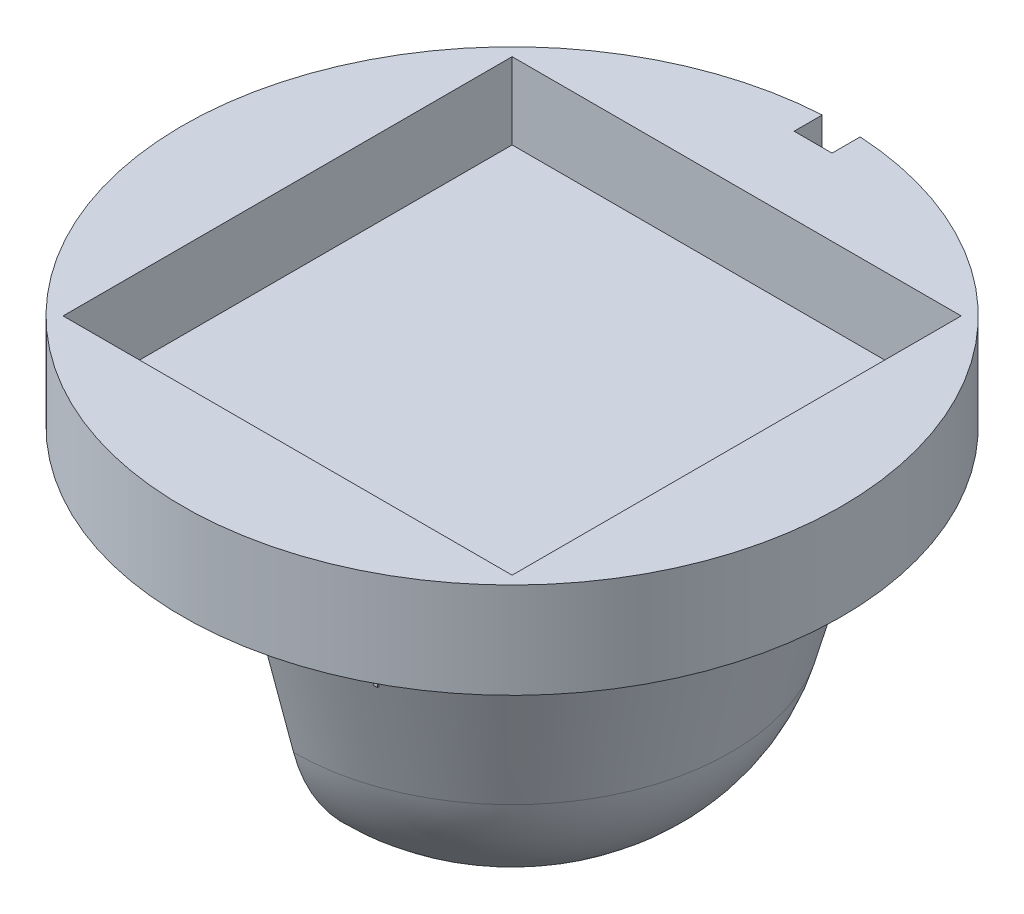
ISO-10303-21;
HEADER;
FILE_DESCRIPTION(('STEP AP214'),'2;1');
FILE_NAME('part.step','',(''),(''),'','','');
FILE_SCHEMA(('AUTOMOTIVE_DESIGN { 1 0 10303 214 1 1 1 1 }'));
ENDSEC;
DATA;
#1=APPLICATION_CONTEXT('core data for automotive mechanical design processes');
#2=APPLICATION_PROTOCOL_DEFINITION('international standard','automotive_design',2000,#1);
#3=PRODUCT_CONTEXT('',#1,'mechanical');
#4=PRODUCT('Part','Part','',(#3));
#5=PRODUCT_RELATED_PRODUCT_CATEGORY('part','',(#4));
#6=PRODUCT_DEFINITION_FORMATION('','',#4);
#7=PRODUCT_DEFINITION_CONTEXT('part definition',#1,'design');
#8=PRODUCT_DEFINITION('design','',#6,#7);
#9=PRODUCT_DEFINITION_SHAPE('','',#8);
#10=(LENGTH_UNIT() NAMED_UNIT(*) SI_UNIT(.MILLI.,.METRE.));
#11=(NAMED_UNIT(*) PLANE_ANGLE_UNIT() SI_UNIT($,.RADIAN.));
#12=(NAMED_UNIT(*) SI_UNIT($,.STERADIAN.) SOLID_ANGLE_UNIT());
#13=UNCERTAINTY_MEASURE_WITH_UNIT(LENGTH_MEASURE(1.E-05),#10,'distance_accuracy_value','');
#14=(GEOMETRIC_REPRESENTATION_CONTEXT(3) GLOBAL_UNCERTAINTY_ASSIGNED_CONTEXT((#13)) GLOBAL_UNIT_ASSIGNED_CONTEXT((#10,
#11,#12)) REPRESENTATION_CONTEXT('',''));
#15=CARTESIAN_POINT('',(0.,0.,0.));
#16=DIRECTION('',(0.,0.,1.));
#17=DIRECTION('',(1.,0.,0.));
#18=AXIS2_PLACEMENT_3D('',#15,#16,#17);
#19=CARTESIAN_POINT('',(0.,-2.,0.));
#20=DIRECTION('',(0.,-1.,0.));
#21=DIRECTION('',(0.,0.,-1.));
#22=AXIS2_PLACEMENT_3D('',#19,#20,#21);
#23=PLANE('',#22);
#24=DIRECTION('',(0.,0.,1.));
#25=VECTOR('',#24,1.);
#26=CARTESIAN_POINT('',(1.98519362052624,-2.,-37.5));
#27=LINE('',#26,#25);
#28=CARTESIAN_POINT('',(1.98519362052624,-2.,-34.4428367921259));
#29=VERTEX_POINT('',#28);
#30=CARTESIAN_POINT('',(1.98519362052624,-2.,-31.5));
#31=VERTEX_POINT('',#30);
#32=EDGE_CURVE('E200',#29,#31,#27,.T.);
#33=ORIENTED_EDGE('',*,*,#32,.F.);
#34=CARTESIAN_POINT('',(0.,-2.,0.));
#35=DIRECTION('',(0.,-1.,0.));
#36=DIRECTION('',(0.,0.,-1.));
#37=AXIS2_PLACEMENT_3D('',#34,#35,#36);
#38=CIRCLE('',#37,34.5);
#39=CARTESIAN_POINT('',(-1.98519362052625,-2.,-34.4428367921259));
#40=VERTEX_POINT('',#39);
#41=EDGE_CURVE('E367',#29,#40,#38,.T.);
#42=ORIENTED_EDGE('',*,*,#41,.T.);
#43=DIRECTION('',(0.,0.,-1.));
#44=VECTOR('',#43,1.);
#45=CARTESIAN_POINT('',(-1.98519362052625,-2.,-37.5));
#46=LINE('',#45,#44);
#47=CARTESIAN_POINT('',(-1.98519362052625,-2.,-31.5));
#48=VERTEX_POINT('',#47);
#49=EDGE_CURVE('E59',#48,#40,#46,.T.);
#50=ORIENTED_EDGE('',*,*,#49,.F.);
#51=DIRECTION('',(-1.,0.,0.));
#52=VECTOR('',#51,1.);
#53=CARTESIAN_POINT('',(-1.98519362052625,-2.,-31.5));
#54=LINE('',#53,#52);
#55=EDGE_CURVE('E224',#31,#48,#54,.T.);
#56=ORIENTED_EDGE('',*,*,#55,.F.);
#57=EDGE_LOOP('',(#33,#42,#50,#56));
#58=FACE_BOUND('',#57,.T.);
#59=DIRECTION('',(0.,0.,-1.));
#60=VECTOR('',#59,1.);
#61=CARTESIAN_POINT('',(0.,-2.,-18.));
#62=LINE('',#61,#60);
#63=CARTESIAN_POINT('',(0.,-2.,-18.));
#64=VERTEX_POINT('',#63);
#65=CARTESIAN_POINT('',(0.,-2.,-27.7320508075689));
#66=VERTEX_POINT('',#65);
#67=EDGE_CURVE('E355',#64,#66,#62,.T.);
#68=ORIENTED_EDGE('',*,*,#67,.F.);
#69=CARTESIAN_POINT('',(0.,-2.,0.));
#70=DIRECTION('',(0.,1.,0.));
#71=DIRECTION('',(0.,0.,-1.));
#72=AXIS2_PLACEMENT_3D('',#69,#70,#71);
#73=CIRCLE('',#72,18.);
#74=CARTESIAN_POINT('',(0.,-2.,18.));
#75=VERTEX_POINT('',#74);
#76=EDGE_CURVE('E345',#75,#64,#73,.T.);
#77=ORIENTED_EDGE('',*,*,#76,.F.);
#78=DIRECTION('',(0.,0.,-1.));
#79=VECTOR('',#78,1.);
#80=CARTESIAN_POINT('',(0.,-2.,28.));
#81=LINE('',#80,#79);
#82=CARTESIAN_POINT('',(0.,-2.,27.7320508075689));
#83=VERTEX_POINT('',#82);
#84=EDGE_CURVE('E351',#83,#75,#81,.T.);
#85=ORIENTED_EDGE('',*,*,#84,.F.);
#86=CARTESIAN_POINT('',(0.,-2.,0.));
#87=DIRECTION('',(0.,-1.,0.));
#88=DIRECTION('',(0.,0.,-1.));
#89=AXIS2_PLACEMENT_3D('',#86,#87,#88);
#90=CIRCLE('',#89,27.7320508075689);
#91=EDGE_CURVE('E421',#83,#66,#90,.F.);
#92=ORIENTED_EDGE('',*,*,#91,.T.);
#93=EDGE_LOOP('',(#68,#77,#85,#92));
#94=FACE_BOUND('',#93,.T.);
#95=ADVANCED_FACE('F43',(#58,#94),#23,.T.);
#96=CARTESIAN_POINT('',(0.,8.,0.));
#97=DIRECTION('',(0.,1.,0.));
#98=DIRECTION('',(0.,0.,1.));
#99=AXIS2_PLACEMENT_3D('',#96,#97,#98);
#100=PLANE('',#99);
#101=DIRECTION('',(0.,0.,1.));
#102=VECTOR('',#101,1.);
#103=CARTESIAN_POINT('',(1.98519362052624,8.,-37.5));
#104=LINE('',#103,#102);
#105=CARTESIAN_POINT('',(1.98519362052624,8.,-34.4428367921259));
#106=VERTEX_POINT('',#105);
#107=CARTESIAN_POINT('',(1.98519362052624,8.,-31.5));
#108=VERTEX_POINT('',#107);
#109=EDGE_CURVE('E198',#106,#108,#104,.T.);
#110=ORIENTED_EDGE('',*,*,#109,.T.);
#111=DIRECTION('',(-1.,0.,0.));
#112=VECTOR('',#111,1.);
#113=CARTESIAN_POINT('',(-1.98519362052625,8.,-31.5));
#114=LINE('',#113,#112);
#115=CARTESIAN_POINT('',(-1.98519362052625,8.,-31.5));
#116=VERTEX_POINT('',#115);
#117=EDGE_CURVE('E209',#108,#116,#114,.T.);
#118=ORIENTED_EDGE('',*,*,#117,.T.);
#119=DIRECTION('',(0.,0.,-1.));
#120=VECTOR('',#119,1.);
#121=CARTESIAN_POINT('',(-1.98519362052625,8.,-37.5));
#122=LINE('',#121,#120);
#123=CARTESIAN_POINT('',(-1.98519362052625,8.,-34.4428367921259));
#124=VERTEX_POINT('',#123);
#125=EDGE_CURVE('E206',#116,#124,#122,.T.);
#126=ORIENTED_EDGE('',*,*,#125,.T.);
#127=CARTESIAN_POINT('',(0.,8.,0.));
#128=DIRECTION('',(0.,1.,0.));
#129=DIRECTION('',(0.,0.,1.));
#130=AXIS2_PLACEMENT_3D('',#127,#128,#129);
#131=CIRCLE('',#130,34.5);
#132=EDGE_CURVE('E220',#124,#106,#131,.T.);
#133=ORIENTED_EDGE('',*,*,#132,.T.);
#134=EDGE_LOOP('',(#110,#118,#126,#133));
#135=FACE_BOUND('',#134,.T.);
#136=DIRECTION('',(-1.,0.,0.));
#137=VECTOR('',#136,1.);
#138=CARTESIAN_POINT('',(-23.5,8.,-23.5));
#139=LINE('',#138,#137);
#140=CARTESIAN_POINT('',(23.5,8.,-23.5));
#141=VERTEX_POINT('',#140);
#142=CARTESIAN_POINT('',(-23.5,8.,-23.5));
#143=VERTEX_POINT('',#142);
#144=EDGE_CURVE('E375',#141,#143,#139,.T.);
#145=ORIENTED_EDGE('',*,*,#144,.F.);
#146=DIRECTION('',(0.,0.,-1.));
#147=VECTOR('',#146,1.);
#148=CARTESIAN_POINT('',(23.5,8.,23.5));
#149=LINE('',#148,#147);
#150=CARTESIAN_POINT('',(23.5,8.,23.5));
#151=VERTEX_POINT('',#150);
#152=EDGE_CURVE('E372',#151,#141,#149,.T.);
#153=ORIENTED_EDGE('',*,*,#152,.F.);
#154=DIRECTION('',(1.,0.,0.));
#155=VECTOR('',#154,1.);
#156=CARTESIAN_POINT('',(-23.5,8.,23.5));
#157=LINE('',#156,#155);
#158=CARTESIAN_POINT('',(-23.5,8.,23.5));
#159=VERTEX_POINT('',#158);
#160=EDGE_CURVE('E383',#159,#151,#157,.T.);
#161=ORIENTED_EDGE('',*,*,#160,.F.);
#162=DIRECTION('',(0.,0.,1.));
#163=VECTOR('',#162,1.);
#164=CARTESIAN_POINT('',(-23.5,8.,23.5));
#165=LINE('',#164,#163);
#166=EDGE_CURVE('E379',#143,#159,#165,.T.);
#167=ORIENTED_EDGE('',*,*,#166,.F.);
#168=EDGE_LOOP('',(#145,#153,#161,#167));
#169=FACE_BOUND('',#168,.T.);
#170=ADVANCED_FACE('F217',(#135,#169),#100,.T.);
#171=CARTESIAN_POINT('',(0.,8.,0.));
#172=DIRECTION('',(0.,-1.,0.));
#173=DIRECTION('',(0.,0.,-1.));
#174=AXIS2_PLACEMENT_3D('',#171,#172,#173);
#175=CYLINDRICAL_SURFACE('',#174,34.5);
#176=ORIENTED_EDGE('',*,*,#41,.F.);
#177=DIRECTION('',(0.,-1.,0.));
#178=VECTOR('',#177,1.);
#179=CARTESIAN_POINT('',(1.98519362052624,8.,-34.4428367921259));
#180=LINE('',#179,#178);
#181=EDGE_CURVE('E12',#29,#106,#180,.F.);
#182=ORIENTED_EDGE('',*,*,#181,.T.);
#183=ORIENTED_EDGE('',*,*,#132,.F.);
#184=DIRECTION('',(0.,-1.,0.));
#185=VECTOR('',#184,1.);
#186=CARTESIAN_POINT('',(-1.98519362052625,8.,-34.4428367921259));
#187=LINE('',#186,#185);
#188=EDGE_CURVE('E52',#124,#40,#187,.T.);
#189=ORIENTED_EDGE('',*,*,#188,.T.);
#190=EDGE_LOOP('',(#176,#182,#183,#189));
#191=FACE_BOUND('',#190,.T.);
#192=ADVANCED_FACE('F434',(#191),#175,.T.);
#193=CARTESIAN_POINT('',(23.5,8.,23.5));
#194=DIRECTION('',(-1.,0.,0.));
#195=DIRECTION('',(0.,0.,1.));
#196=AXIS2_PLACEMENT_3D('',#193,#194,#195);
#197=PLANE('',#196);
#198=DIRECTION('',(0.,0.,-1.));
#199=VECTOR('',#198,1.);
#200=CARTESIAN_POINT('',(23.5,0.,23.5));
#201=LINE('',#200,#199);
#202=CARTESIAN_POINT('',(23.5,0.,23.5));
#203=VERTEX_POINT('',#202);
#204=CARTESIAN_POINT('',(23.5,0.,-23.5));
#205=VERTEX_POINT('',#204);
#206=EDGE_CURVE('E371',#203,#205,#201,.T.);
#207=ORIENTED_EDGE('',*,*,#206,.F.);
#208=DIRECTION('',(0.,-1.,0.));
#209=VECTOR('',#208,1.);
#210=CARTESIAN_POINT('',(23.5,8.,23.5));
#211=LINE('',#210,#209);
#212=EDGE_CURVE('E386',#151,#203,#211,.T.);
#213=ORIENTED_EDGE('',*,*,#212,.F.);
#214=ORIENTED_EDGE('',*,*,#152,.T.);
#215=DIRECTION('',(0.,-1.,0.));
#216=VECTOR('',#215,1.);
#217=CARTESIAN_POINT('',(23.5,8.,-23.5));
#218=LINE('',#217,#216);
#219=EDGE_CURVE('E409',#141,#205,#218,.T.);
#220=ORIENTED_EDGE('',*,*,#219,.T.);
#221=EDGE_LOOP('',(#207,#213,#214,#220));
#222=FACE_BOUND('',#221,.T.);
#223=ADVANCED_FACE('F493',(#222),#197,.T.);
#224=CARTESIAN_POINT('',(-23.5,8.,-23.5));
#225=DIRECTION('',(0.,0.,1.));
#226=DIRECTION('',(1.,0.,0.));
#227=AXIS2_PLACEMENT_3D('',#224,#225,#226);
#228=PLANE('',#227);
#229=DIRECTION('',(-1.,0.,0.));
#230=VECTOR('',#229,1.);
#231=CARTESIAN_POINT('',(-23.5,0.,-23.5));
#232=LINE('',#231,#230);
#233=CARTESIAN_POINT('',(-23.5,0.,-23.5));
#234=VERTEX_POINT('',#233);
#235=EDGE_CURVE('E390',#205,#234,#232,.T.);
#236=ORIENTED_EDGE('',*,*,#235,.F.);
#237=ORIENTED_EDGE('',*,*,#219,.F.);
#238=ORIENTED_EDGE('',*,*,#144,.T.);
#239=DIRECTION('',(0.,-1.,0.));
#240=VECTOR('',#239,1.);
#241=CARTESIAN_POINT('',(-23.5,8.,-23.5));
#242=LINE('',#241,#240);
#243=EDGE_CURVE('E406',#143,#234,#242,.T.);
#244=ORIENTED_EDGE('',*,*,#243,.T.);
#245=EDGE_LOOP('',(#236,#237,#238,#244));
#246=FACE_BOUND('',#245,.T.);
#247=ADVANCED_FACE('F489',(#246),#228,.T.);
#248=CARTESIAN_POINT('',(-23.5,8.,23.5));
#249=DIRECTION('',(1.,0.,0.));
#250=DIRECTION('',(0.,0.,-1.));
#251=AXIS2_PLACEMENT_3D('',#248,#249,#250);
#252=PLANE('',#251);
#253=DIRECTION('',(0.,0.,1.));
#254=VECTOR('',#253,1.);
#255=CARTESIAN_POINT('',(-23.5,0.,23.5));
#256=LINE('',#255,#254);
#257=CARTESIAN_POINT('',(-23.5,0.,23.5));
#258=VERTEX_POINT('',#257);
#259=EDGE_CURVE('E394',#234,#258,#256,.T.);
#260=ORIENTED_EDGE('',*,*,#259,.F.);
#261=ORIENTED_EDGE('',*,*,#243,.F.);
#262=ORIENTED_EDGE('',*,*,#166,.T.);
#263=DIRECTION('',(0.,-1.,0.));
#264=VECTOR('',#263,1.);
#265=CARTESIAN_POINT('',(-23.5,8.,23.5));
#266=LINE('',#265,#264);
#267=EDGE_CURVE('E403',#159,#258,#266,.T.);
#268=ORIENTED_EDGE('',*,*,#267,.T.);
#269=EDGE_LOOP('',(#260,#261,#262,#268));
#270=FACE_BOUND('',#269,.T.);
#271=ADVANCED_FACE('F485',(#270),#252,.T.);
#272=CARTESIAN_POINT('',(-23.5,8.,23.5));
#273=DIRECTION('',(0.,0.,-1.));
#274=DIRECTION('',(-1.,0.,0.));
#275=AXIS2_PLACEMENT_3D('',#272,#273,#274);
#276=PLANE('',#275);
#277=DIRECTION('',(1.,0.,0.));
#278=VECTOR('',#277,1.);
#279=CARTESIAN_POINT('',(-23.5,0.,23.5));
#280=LINE('',#279,#278);
#281=EDGE_CURVE('E376',#258,#203,#280,.T.);
#282=ORIENTED_EDGE('',*,*,#281,.F.);
#283=ORIENTED_EDGE('',*,*,#267,.F.);
#284=ORIENTED_EDGE('',*,*,#160,.T.);
#285=ORIENTED_EDGE('',*,*,#212,.T.);
#286=EDGE_LOOP('',(#282,#283,#284,#285));
#287=FACE_BOUND('',#286,.T.);
#288=ADVANCED_FACE('F481',(#287),#276,.T.);
#289=CARTESIAN_POINT('',(0.,0.,0.));
#290=DIRECTION('',(0.,-1.,0.));
#291=DIRECTION('',(0.,0.,-1.));
#292=AXIS2_PLACEMENT_3D('',#289,#290,#291);
#293=PLANE('',#292);
#294=ORIENTED_EDGE('',*,*,#281,.T.);
#295=ORIENTED_EDGE('',*,*,#206,.T.);
#296=ORIENTED_EDGE('',*,*,#235,.T.);
#297=ORIENTED_EDGE('',*,*,#259,.T.);
#298=EDGE_LOOP('',(#294,#295,#296,#297));
#299=FACE_BOUND('',#298,.T.);
#300=ADVANCED_FACE('F477',(#299),#293,.F.);
#301=CARTESIAN_POINT('',(0.,-26.,0.));
#302=DIRECTION('',(0.,1.,0.));
#303=DIRECTION('',(0.,0.,1.));
#304=AXIS2_PLACEMENT_3D('',#301,#302,#303);
#305=CYLINDRICAL_SURFACE('',#304,18.);
#306=ORIENTED_EDGE('',*,*,#76,.T.);
#307=DIRECTION('',(0.,1.,0.));
#308=VECTOR('',#307,1.);
#309=CARTESIAN_POINT('',(0.,-26.,-18.));
#310=LINE('',#309,#308);
#311=CARTESIAN_POINT('',(0.,-26.,-18.));
#312=VERTEX_POINT('',#311);
#313=EDGE_CURVE('E364',#312,#64,#310,.T.);
#314=ORIENTED_EDGE('',*,*,#313,.F.);
#315=CARTESIAN_POINT('',(0.,-26.,0.));
#316=DIRECTION('',(0.,1.,0.));
#317=DIRECTION('',(0.,0.,-1.));
#318=AXIS2_PLACEMENT_3D('',#315,#316,#317);
#319=CIRCLE('',#318,18.);
#320=CARTESIAN_POINT('',(0.,-26.,18.));
#321=VERTEX_POINT('',#320);
#322=EDGE_CURVE('E346',#321,#312,#319,.T.);
#323=ORIENTED_EDGE('',*,*,#322,.F.);
#324=DIRECTION('',(0.,1.,0.));
#325=VECTOR('',#324,1.);
#326=CARTESIAN_POINT('',(0.,-26.,18.));
#327=LINE('',#326,#325);
#328=EDGE_CURVE('E350',#321,#75,#327,.T.);
#329=ORIENTED_EDGE('',*,*,#328,.T.);
#330=EDGE_LOOP('',(#306,#314,#323,#329));
#331=FACE_BOUND('',#330,.T.);
#332=ADVANCED_FACE('F461',(#331),#305,.F.);
#333=CARTESIAN_POINT('',(0.,-26.,-18.));
#334=DIRECTION('',(1.,0.,0.));
#335=DIRECTION('',(0.,0.,-1.));
#336=AXIS2_PLACEMENT_3D('',#333,#334,#335);
#337=PLANE('',#336);
#338=DIRECTION('',(0.,0.,1.));
#339=VECTOR('',#338,1.);
#340=CARTESIAN_POINT('',(0.,-8.66672781678168,-24.1));
#341=LINE('',#340,#339);
#342=CARTESIAN_POINT('',(0.,-8.66672781678168,-24.1));
#343=VERTEX_POINT('',#342);
#344=CARTESIAN_POINT('',(0.,-8.66672781678168,-19.4));
#345=VERTEX_POINT('',#344);
#346=EDGE_CURVE('E257',#343,#345,#341,.T.);
#347=ORIENTED_EDGE('',*,*,#346,.F.);
#348=DIRECTION('',(0.,-1.,0.));
#349=VECTOR('',#348,1.);
#350=CARTESIAN_POINT('',(0.,-3.96672781678169,-24.1));
#351=LINE('',#350,#349);
#352=CARTESIAN_POINT('',(0.,-3.96672781678169,-24.1));
#353=VERTEX_POINT('',#352);
#354=EDGE_CURVE('E254',#353,#343,#351,.T.);
#355=ORIENTED_EDGE('',*,*,#354,.F.);
#356=DIRECTION('',(0.,0.,-1.));
#357=VECTOR('',#356,1.);
#358=CARTESIAN_POINT('',(0.,-3.96672781678169,-24.1));
#359=LINE('',#358,#357);
#360=CARTESIAN_POINT('',(0.,-3.96672781678169,-19.4));
#361=VERTEX_POINT('',#360);
#362=EDGE_CURVE('E241',#361,#353,#359,.T.);
#363=ORIENTED_EDGE('',*,*,#362,.F.);
#364=DIRECTION('',(0.,1.,0.));
#365=VECTOR('',#364,1.);
#366=CARTESIAN_POINT('',(0.,-3.96672781678169,-19.4));
#367=LINE('',#366,#365);
#368=EDGE_CURVE('E262',#345,#361,#367,.T.);
#369=ORIENTED_EDGE('',*,*,#368,.F.);
#370=EDGE_LOOP('',(#347,#355,#363,#369));
#371=FACE_BOUND('',#370,.T.);
#372=DIRECTION('',(0.,0.965925826289066,-0.258819045102528));
#373=VECTOR('',#372,1.);
#374=CARTESIAN_POINT('',(0.,-105.497422611925,0.));
#375=LINE('',#374,#373);
#376=CARTESIAN_POINT('',(0.,-20.1360214514236,-22.8725185057462));
#377=VERTEX_POINT('',#376);
#378=EDGE_CURVE('E418',#66,#377,#375,.F.);
#379=ORIENTED_EDGE('',*,*,#378,.T.);
#380=CARTESIAN_POINT('',(0.,-14.959640549373,-3.55400197996491));
#381=DIRECTION('',(1.,0.,0.));
#382=DIRECTION('',(0.,0.,-1.));
#383=AXIS2_PLACEMENT_3D('',#380,#381,#382);
#384=CIRCLE('',#383,20.);
#385=CARTESIAN_POINT('',(0.,-31.,-15.5));
#386=VERTEX_POINT('',#385);
#387=EDGE_CURVE('E429',#377,#386,#384,.F.);
#388=ORIENTED_EDGE('',*,*,#387,.T.);
#389=DIRECTION('',(0.,1.,0.));
#390=VECTOR('',#389,1.);
#391=CARTESIAN_POINT('',(0.,-31.,-15.5));
#392=LINE('',#391,#390);
#393=CARTESIAN_POINT('',(0.,-26.,-15.5));
#394=VERTEX_POINT('',#393);
#395=EDGE_CURVE('E328',#386,#394,#392,.T.);
#396=ORIENTED_EDGE('',*,*,#395,.T.);
#397=DIRECTION('',(0.,0.,-1.));
#398=VECTOR('',#397,1.);
#399=CARTESIAN_POINT('',(0.,-26.,-15.5));
#400=LINE('',#399,#398);
#401=EDGE_CURVE('E329',#394,#312,#400,.T.);
#402=ORIENTED_EDGE('',*,*,#401,.T.);
#403=ORIENTED_EDGE('',*,*,#313,.T.);
#404=ORIENTED_EDGE('',*,*,#67,.T.);
#405=EDGE_LOOP('',(#379,#388,#396,#402,#403,#404));
#406=FACE_BOUND('',#405,.T.);
#407=ADVANCED_FACE('F444',(#371,#406),#337,.F.);
#408=CARTESIAN_POINT('',(0.,-26.,28.));
#409=DIRECTION('',(1.,0.,0.));
#410=DIRECTION('',(0.,0.,-1.));
#411=AXIS2_PLACEMENT_3D('',#408,#409,#410);
#412=PLANE('',#411);
#413=DIRECTION('',(0.,0.,-1.));
#414=VECTOR('',#413,1.);
#415=CARTESIAN_POINT('',(0.,-3.9667278,24.1));
#416=LINE('',#415,#414);
#417=CARTESIAN_POINT('',(0.,-3.9667278,24.1));
#418=VERTEX_POINT('',#417);
#419=CARTESIAN_POINT('',(0.,-3.9667278,19.4));
#420=VERTEX_POINT('',#419);
#421=EDGE_CURVE('E302',#418,#420,#416,.T.);
#422=ORIENTED_EDGE('',*,*,#421,.F.);
#423=DIRECTION('',(0.,1.,0.));
#424=VECTOR('',#423,1.);
#425=CARTESIAN_POINT('',(0.,-3.9667278,24.1));
#426=LINE('',#425,#424);
#427=CARTESIAN_POINT('',(0.,-8.6429328472573,24.1));
#428=VERTEX_POINT('',#427);
#429=EDGE_CURVE('E234',#428,#418,#426,.T.);
#430=ORIENTED_EDGE('',*,*,#429,.F.);
#431=DIRECTION('',(0.,0.,1.));
#432=VECTOR('',#431,1.);
#433=CARTESIAN_POINT('',(0.,-8.6429328472573,24.1));
#434=LINE('',#433,#432);
#435=CARTESIAN_POINT('',(0.,-8.6429328472573,19.4));
#436=VERTEX_POINT('',#435);
#437=EDGE_CURVE('E287',#436,#428,#434,.T.);
#438=ORIENTED_EDGE('',*,*,#437,.F.);
#439=DIRECTION('',(0.,-1.,0.));
#440=VECTOR('',#439,1.);
#441=CARTESIAN_POINT('',(0.,-3.9667278,19.4));
#442=LINE('',#441,#440);
#443=EDGE_CURVE('E306',#420,#436,#442,.T.);
#444=ORIENTED_EDGE('',*,*,#443,.F.);
#445=EDGE_LOOP('',(#422,#430,#438,#444));
#446=FACE_BOUND('',#445,.T.);
#447=DIRECTION('',(0.,1.,0.));
#448=VECTOR('',#447,1.);
#449=CARTESIAN_POINT('',(0.,-31.,15.5));
#450=LINE('',#449,#448);
#451=CARTESIAN_POINT('',(0.,-31.,15.5));
#452=VERTEX_POINT('',#451);
#453=CARTESIAN_POINT('',(0.,-26.,15.5));
#454=VERTEX_POINT('',#453);
#455=EDGE_CURVE('E341',#452,#454,#450,.T.);
#456=ORIENTED_EDGE('',*,*,#455,.F.);
#457=CARTESIAN_POINT('',(0.,-14.959640549373,3.55400197996491));
#458=DIRECTION('',(1.,0.,0.));
#459=DIRECTION('',(0.,0.,-1.));
#460=AXIS2_PLACEMENT_3D('',#457,#458,#459);
#461=CIRCLE('',#460,20.);
#462=CARTESIAN_POINT('',(0.,-20.1360214514236,22.8725185057462));
#463=VERTEX_POINT('',#462);
#464=EDGE_CURVE('E424',#452,#463,#461,.F.);
#465=ORIENTED_EDGE('',*,*,#464,.T.);
#466=DIRECTION('',(0.,-0.965925826289066,-0.258819045102528));
#467=VECTOR('',#466,1.);
#468=CARTESIAN_POINT('',(0.,-105.497422611925,0.));
#469=LINE('',#468,#467);
#470=EDGE_CURVE('E415',#463,#83,#469,.F.);
#471=ORIENTED_EDGE('',*,*,#470,.T.);
#472=ORIENTED_EDGE('',*,*,#84,.T.);
#473=ORIENTED_EDGE('',*,*,#328,.F.);
#474=DIRECTION('',(0.,0.,-1.));
#475=VECTOR('',#474,1.);
#476=CARTESIAN_POINT('',(0.,-26.,28.));
#477=LINE('',#476,#475);
#478=EDGE_CURVE('E272',#321,#454,#477,.T.);
#479=ORIENTED_EDGE('',*,*,#478,.T.);
#480=EDGE_LOOP('',(#456,#465,#471,#472,#473,#479));
#481=FACE_BOUND('',#480,.T.);
#482=ADVANCED_FACE('F462',(#446,#481),#412,.F.);
#483=CARTESIAN_POINT('',(0.,-26.,0.));
#484=DIRECTION('',(0.,-1.,0.));
#485=DIRECTION('',(0.,0.,-1.));
#486=AXIS2_PLACEMENT_3D('',#483,#484,#485);
#487=PLANE('',#486);
#488=ORIENTED_EDGE('',*,*,#478,.F.);
#489=ORIENTED_EDGE('',*,*,#322,.T.);
#490=ORIENTED_EDGE('',*,*,#401,.F.);
#491=CARTESIAN_POINT('',(0.,-26.,0.));
#492=DIRECTION('',(0.,1.,0.));
#493=DIRECTION('',(0.,0.,-1.));
#494=AXIS2_PLACEMENT_3D('',#491,#492,#493);
#495=CIRCLE('',#494,15.5);
#496=EDGE_CURVE('E332',#454,#394,#495,.T.);
#497=ORIENTED_EDGE('',*,*,#496,.F.);
#498=EDGE_LOOP('',(#488,#489,#490,#497));
#499=FACE_BOUND('',#498,.T.);
#500=ADVANCED_FACE('F458',(#499),#487,.F.);
#501=CARTESIAN_POINT('',(0.,-31.,0.));
#502=DIRECTION('',(0.,1.,0.));
#503=DIRECTION('',(0.,0.,1.));
#504=AXIS2_PLACEMENT_3D('',#501,#502,#503);
#505=CYLINDRICAL_SURFACE('',#504,15.5);
#506=ORIENTED_EDGE('',*,*,#496,.T.);
#507=ORIENTED_EDGE('',*,*,#395,.F.);
#508=CARTESIAN_POINT('',(0.,-31.,0.));
#509=DIRECTION('',(0.,1.,0.));
#510=DIRECTION('',(0.,0.,-1.));
#511=AXIS2_PLACEMENT_3D('',#508,#509,#510);
#512=CIRCLE('',#511,15.5);
#513=EDGE_CURVE('E324',#452,#386,#512,.T.);
#514=ORIENTED_EDGE('',*,*,#513,.F.);
#515=ORIENTED_EDGE('',*,*,#455,.T.);
#516=EDGE_LOOP('',(#506,#507,#514,#515));
#517=FACE_BOUND('',#516,.T.);
#518=ADVANCED_FACE('F454',(#517),#505,.F.);
#519=CARTESIAN_POINT('',(9.99999999999999,-3.9667278,24.1));
#520=DIRECTION('',(0.,0.,1.));
#521=DIRECTION('',(1.,0.,0.));
#522=AXIS2_PLACEMENT_3D('',#519,#520,#521);
#523=PLANE('',#522);
#524=ORIENTED_EDGE('',*,*,#429,.T.);
#525=DIRECTION('',(-1.,0.,0.));
#526=VECTOR('',#525,1.);
#527=CARTESIAN_POINT('',(9.99999999999999,-3.9667278,24.1));
#528=LINE('',#527,#526);
#529=CARTESIAN_POINT('',(9.99999999999999,-3.9667278,24.1));
#530=VERTEX_POINT('',#529);
#531=EDGE_CURVE('E299',#530,#418,#528,.T.);
#532=ORIENTED_EDGE('',*,*,#531,.F.);
#533=DIRECTION('',(0.,1.,0.));
#534=VECTOR('',#533,1.);
#535=CARTESIAN_POINT('',(9.99999999999999,-3.9667278,24.1));
#536=LINE('',#535,#534);
#537=CARTESIAN_POINT('',(9.99999999999999,-8.6429328472573,24.1));
#538=VERTEX_POINT('',#537);
#539=EDGE_CURVE('E282',#538,#530,#536,.T.);
#540=ORIENTED_EDGE('',*,*,#539,.F.);
#541=DIRECTION('',(-1.,0.,0.));
#542=VECTOR('',#541,1.);
#543=CARTESIAN_POINT('',(9.99999999999999,-8.6429328472573,24.1));
#544=LINE('',#543,#542);
#545=EDGE_CURVE('E258',#538,#428,#544,.T.);
#546=ORIENTED_EDGE('',*,*,#545,.T.);
#547=EDGE_LOOP('',(#524,#532,#540,#546));
#548=FACE_BOUND('',#547,.T.);
#549=ADVANCED_FACE('F542',(#548),#523,.F.);
#550=CARTESIAN_POINT('',(9.99999999999999,-8.6429328472573,24.1));
#551=DIRECTION('',(0.,-1.,0.));
#552=DIRECTION('',(0.,0.,-1.));
#553=AXIS2_PLACEMENT_3D('',#550,#551,#552);
#554=PLANE('',#553);
#555=ORIENTED_EDGE('',*,*,#437,.T.);
#556=ORIENTED_EDGE('',*,*,#545,.F.);
#557=DIRECTION('',(0.,0.,1.));
#558=VECTOR('',#557,1.);
#559=CARTESIAN_POINT('',(9.99999999999999,-8.6429328472573,24.1));
#560=LINE('',#559,#558);
#561=CARTESIAN_POINT('',(9.99999999999999,-8.6429328472573,19.4));
#562=VERTEX_POINT('',#561);
#563=EDGE_CURVE('E295',#562,#538,#560,.T.);
#564=ORIENTED_EDGE('',*,*,#563,.F.);
#565=DIRECTION('',(-1.,0.,0.));
#566=VECTOR('',#565,1.);
#567=CARTESIAN_POINT('',(9.99999999999999,-8.6429328472573,19.4));
#568=LINE('',#567,#566);
#569=EDGE_CURVE('E315',#562,#436,#568,.T.);
#570=ORIENTED_EDGE('',*,*,#569,.T.);
#571=EDGE_LOOP('',(#555,#556,#564,#570));
#572=FACE_BOUND('',#571,.T.);
#573=ADVANCED_FACE('F538',(#572),#554,.F.);
#574=CARTESIAN_POINT('',(9.99999999999999,-3.9667278,19.4));
#575=DIRECTION('',(0.,0.,-1.));
#576=DIRECTION('',(-1.,0.,0.));
#577=AXIS2_PLACEMENT_3D('',#574,#575,#576);
#578=PLANE('',#577);
#579=ORIENTED_EDGE('',*,*,#443,.T.);
#580=ORIENTED_EDGE('',*,*,#569,.F.);
#581=DIRECTION('',(0.,-1.,0.));
#582=VECTOR('',#581,1.);
#583=CARTESIAN_POINT('',(9.99999999999999,-3.9667278,19.4));
#584=LINE('',#583,#582);
#585=CARTESIAN_POINT('',(9.99999999999999,-3.9667278,19.4));
#586=VERTEX_POINT('',#585);
#587=EDGE_CURVE('E291',#586,#562,#584,.T.);
#588=ORIENTED_EDGE('',*,*,#587,.F.);
#589=DIRECTION('',(-1.,0.,0.));
#590=VECTOR('',#589,1.);
#591=CARTESIAN_POINT('',(9.99999999999999,-3.9667278,19.4));
#592=LINE('',#591,#590);
#593=EDGE_CURVE('E318',#586,#420,#592,.T.);
#594=ORIENTED_EDGE('',*,*,#593,.T.);
#595=EDGE_LOOP('',(#579,#580,#588,#594));
#596=FACE_BOUND('',#595,.T.);
#597=ADVANCED_FACE('F541',(#596),#578,.F.);
#598=CARTESIAN_POINT('',(9.99999999999999,-3.9667278,24.1));
#599=DIRECTION('',(0.,1.,0.));
#600=DIRECTION('',(0.,0.,1.));
#601=AXIS2_PLACEMENT_3D('',#598,#599,#600);
#602=PLANE('',#601);
#603=ORIENTED_EDGE('',*,*,#421,.T.);
#604=ORIENTED_EDGE('',*,*,#593,.F.);
#605=DIRECTION('',(0.,0.,-1.));
#606=VECTOR('',#605,1.);
#607=CARTESIAN_POINT('',(9.99999999999999,-3.9667278,24.1));
#608=LINE('',#607,#606);
#609=EDGE_CURVE('E286',#530,#586,#608,.T.);
#610=ORIENTED_EDGE('',*,*,#609,.F.);
#611=ORIENTED_EDGE('',*,*,#531,.T.);
#612=EDGE_LOOP('',(#603,#604,#610,#611));
#613=FACE_BOUND('',#612,.T.);
#614=ADVANCED_FACE('F536',(#613),#602,.F.);
#615=CARTESIAN_POINT('',(10.,0.,0.));
#616=DIRECTION('',(1.,0.,0.));
#617=DIRECTION('',(0.,0.,-1.));
#618=AXIS2_PLACEMENT_3D('',#615,#616,#617);
#619=PLANE('',#618);
#620=ORIENTED_EDGE('',*,*,#539,.T.);
#621=ORIENTED_EDGE('',*,*,#609,.T.);
#622=ORIENTED_EDGE('',*,*,#587,.T.);
#623=ORIENTED_EDGE('',*,*,#563,.T.);
#624=EDGE_LOOP('',(#620,#621,#622,#623));
#625=FACE_BOUND('',#624,.T.);
#626=ADVANCED_FACE('F532',(#625),#619,.F.);
#627=CARTESIAN_POINT('',(10.,-3.96672781678169,-24.1));
#628=DIRECTION('',(0.,0.,-1.));
#629=DIRECTION('',(0.,1.,0.));
#630=AXIS2_PLACEMENT_3D('',#627,#628,#629);
#631=PLANE('',#630);
#632=ORIENTED_EDGE('',*,*,#354,.T.);
#633=DIRECTION('',(-1.,0.,0.));
#634=VECTOR('',#633,1.);
#635=CARTESIAN_POINT('',(10.,-8.66672781678168,-24.1));
#636=LINE('',#635,#634);
#637=CARTESIAN_POINT('',(10.,-8.66672781678168,-24.1));
#638=VERTEX_POINT('',#637);
#639=EDGE_CURVE('E253',#638,#343,#636,.T.);
#640=ORIENTED_EDGE('',*,*,#639,.F.);
#641=DIRECTION('',(0.,-1.,0.));
#642=VECTOR('',#641,1.);
#643=CARTESIAN_POINT('',(10.,-3.96672781678169,-24.1));
#644=LINE('',#643,#642);
#645=CARTESIAN_POINT('',(10.,-3.96672781678169,-24.1));
#646=VERTEX_POINT('',#645);
#647=EDGE_CURVE('E236',#646,#638,#644,.T.);
#648=ORIENTED_EDGE('',*,*,#647,.F.);
#649=DIRECTION('',(-1.,0.,0.));
#650=VECTOR('',#649,1.);
#651=CARTESIAN_POINT('',(10.,-3.96672781678169,-24.1));
#652=LINE('',#651,#650);
#653=EDGE_CURVE('E269',#646,#353,#652,.T.);
#654=ORIENTED_EDGE('',*,*,#653,.T.);
#655=EDGE_LOOP('',(#632,#640,#648,#654));
#656=FACE_BOUND('',#655,.T.);
#657=ADVANCED_FACE('F525',(#656),#631,.F.);
#658=CARTESIAN_POINT('',(10.,-3.96672781678169,-24.1));
#659=DIRECTION('',(0.,1.,0.));
#660=DIRECTION('',(0.,0.,1.));
#661=AXIS2_PLACEMENT_3D('',#658,#659,#660);
#662=PLANE('',#661);
#663=ORIENTED_EDGE('',*,*,#362,.T.);
#664=ORIENTED_EDGE('',*,*,#653,.F.);
#665=DIRECTION('',(0.,0.,-1.));
#666=VECTOR('',#665,1.);
#667=CARTESIAN_POINT('',(10.,-3.96672781678169,-24.1));
#668=LINE('',#667,#666);
#669=CARTESIAN_POINT('',(10.,-3.96672781678169,-19.4));
#670=VERTEX_POINT('',#669);
#671=EDGE_CURVE('E249',#670,#646,#668,.T.);
#672=ORIENTED_EDGE('',*,*,#671,.F.);
#673=DIRECTION('',(-1.,0.,0.));
#674=VECTOR('',#673,1.);
#675=CARTESIAN_POINT('',(10.,-3.96672781678169,-19.4));
#676=LINE('',#675,#674);
#677=EDGE_CURVE('E273',#670,#361,#676,.T.);
#678=ORIENTED_EDGE('',*,*,#677,.T.);
#679=EDGE_LOOP('',(#663,#664,#672,#678));
#680=FACE_BOUND('',#679,.T.);
#681=ADVANCED_FACE('F522',(#680),#662,.F.);
#682=CARTESIAN_POINT('',(10.,-3.96672781678169,-19.4));
#683=DIRECTION('',(0.,0.,1.));
#684=DIRECTION('',(1.,0.,0.));
#685=AXIS2_PLACEMENT_3D('',#682,#683,#684);
#686=PLANE('',#685);
#687=ORIENTED_EDGE('',*,*,#368,.T.);
#688=ORIENTED_EDGE('',*,*,#677,.F.);
#689=DIRECTION('',(0.,1.,0.));
#690=VECTOR('',#689,1.);
#691=CARTESIAN_POINT('',(10.,-3.96672781678169,-19.4));
#692=LINE('',#691,#690);
#693=CARTESIAN_POINT('',(10.,-8.66672781678168,-19.4));
#694=VERTEX_POINT('',#693);
#695=EDGE_CURVE('E245',#694,#670,#692,.T.);
#696=ORIENTED_EDGE('',*,*,#695,.F.);
#697=DIRECTION('',(-1.,0.,0.));
#698=VECTOR('',#697,1.);
#699=CARTESIAN_POINT('',(10.,-8.66672781678168,-19.4));
#700=LINE('',#699,#698);
#701=EDGE_CURVE('E276',#694,#345,#700,.T.);
#702=ORIENTED_EDGE('',*,*,#701,.T.);
#703=EDGE_LOOP('',(#687,#688,#696,#702));
#704=FACE_BOUND('',#703,.T.);
#705=ADVANCED_FACE('F516',(#704),#686,.F.);
#706=CARTESIAN_POINT('',(10.,-8.66672781678168,-24.1));
#707=DIRECTION('',(0.,-1.,0.));
#708=DIRECTION('',(0.,0.,-1.));
#709=AXIS2_PLACEMENT_3D('',#706,#707,#708);
#710=PLANE('',#709);
#711=ORIENTED_EDGE('',*,*,#346,.T.);
#712=ORIENTED_EDGE('',*,*,#701,.F.);
#713=DIRECTION('',(0.,0.,1.));
#714=VECTOR('',#713,1.);
#715=CARTESIAN_POINT('',(10.,-8.66672781678168,-24.1));
#716=LINE('',#715,#714);
#717=EDGE_CURVE('E240',#638,#694,#716,.T.);
#718=ORIENTED_EDGE('',*,*,#717,.F.);
#719=ORIENTED_EDGE('',*,*,#639,.T.);
#720=EDGE_LOOP('',(#711,#712,#718,#719));
#721=FACE_BOUND('',#720,.T.);
#722=ADVANCED_FACE('F510',(#721),#710,.F.);
#723=CARTESIAN_POINT('',(10.,0.,0.));
#724=DIRECTION('',(-1.,0.,0.));
#725=DIRECTION('',(0.,0.,1.));
#726=AXIS2_PLACEMENT_3D('',#723,#724,#725);
#727=PLANE('',#726);
#728=ORIENTED_EDGE('',*,*,#647,.T.);
#729=ORIENTED_EDGE('',*,*,#717,.T.);
#730=ORIENTED_EDGE('',*,*,#695,.T.);
#731=ORIENTED_EDGE('',*,*,#671,.T.);
#732=EDGE_LOOP('',(#728,#729,#730,#731));
#733=FACE_BOUND('',#732,.T.);
#734=ADVANCED_FACE('F505',(#733),#727,.T.);
#735=CARTESIAN_POINT('',(0.,-31.,0.));
#736=DIRECTION('',(0.,1.,0.));
#737=DIRECTION('',(0.,0.,1.));
#738=AXIS2_PLACEMENT_3D('',#735,#736,#737);
#739=CONICAL_SURFACE('',#738,19.9615242270661,0.261799387799157);
#740=ORIENTED_EDGE('',*,*,#470,.F.);
#741=CARTESIAN_POINT('',(0.,-20.1360214514236,0.));
#742=DIRECTION('',(0.,1.,0.));
#743=DIRECTION('',(0.,0.,1.));
#744=AXIS2_PLACEMENT_3D('',#741,#742,#743);
#745=CIRCLE('',#744,22.8725185057462);
#746=EDGE_CURVE('E67',#463,#377,#745,.T.);
#747=ORIENTED_EDGE('',*,*,#746,.T.);
#748=ORIENTED_EDGE('',*,*,#378,.F.);
#749=ORIENTED_EDGE('',*,*,#91,.F.);
#750=EDGE_LOOP('',(#740,#747,#748,#749));
#751=FACE_BOUND('',#750,.T.);
#752=ADVANCED_FACE('F446',(#751),#739,.T.);
#753=CARTESIAN_POINT('',(0.,-14.959640549373,0.));
#754=DIRECTION('',(0.,-1.,0.));
#755=DIRECTION('',(0.,0.,-1.));
#756=AXIS2_PLACEMENT_3D('',#753,#754,#755);
#757=DEGENERATE_TOROIDAL_SURFACE('',#756,3.55400197996491,20.,.T.);
#758=ORIENTED_EDGE('',*,*,#387,.F.);
#759=ORIENTED_EDGE('',*,*,#746,.F.);
#760=ORIENTED_EDGE('',*,*,#464,.F.);
#761=ORIENTED_EDGE('',*,*,#513,.T.);
#762=EDGE_LOOP('',(#758,#759,#760,#761));
#763=FACE_BOUND('',#762,.T.);
#764=ADVANCED_FACE('F45',(#763),#757,.T.);
#765=CARTESIAN_POINT('',(1.98519362052624,8.,-37.5));
#766=DIRECTION('',(1.,0.,0.));
#767=DIRECTION('',(0.,0.,-1.));
#768=AXIS2_PLACEMENT_3D('',#765,#766,#767);
#769=PLANE('',#768);
#770=ORIENTED_EDGE('',*,*,#32,.T.);
#771=DIRECTION('',(0.,-1.,0.));
#772=VECTOR('',#771,1.);
#773=CARTESIAN_POINT('',(1.98519362052624,8.,-31.5));
#774=LINE('',#773,#772);
#775=EDGE_CURVE('E194',#108,#31,#774,.T.);
#776=ORIENTED_EDGE('',*,*,#775,.F.);
#777=ORIENTED_EDGE('',*,*,#109,.F.);
#778=ORIENTED_EDGE('',*,*,#181,.F.);
#779=EDGE_LOOP('',(#770,#776,#777,#778));
#780=FACE_BOUND('',#779,.T.);
#781=ADVANCED_FACE('F196',(#780),#769,.F.);
#782=CARTESIAN_POINT('',(-1.98519362052625,8.,-37.5));
#783=DIRECTION('',(-1.,0.,0.));
#784=DIRECTION('',(0.,0.,1.));
#785=AXIS2_PLACEMENT_3D('',#782,#783,#784);
#786=PLANE('',#785);
#787=ORIENTED_EDGE('',*,*,#125,.F.);
#788=DIRECTION('',(0.,-1.,0.));
#789=VECTOR('',#788,1.);
#790=CARTESIAN_POINT('',(-1.98519362052625,8.,-31.5));
#791=LINE('',#790,#789);
#792=EDGE_CURVE('E205',#116,#48,#791,.T.);
#793=ORIENTED_EDGE('',*,*,#792,.T.);
#794=ORIENTED_EDGE('',*,*,#49,.T.);
#795=ORIENTED_EDGE('',*,*,#188,.F.);
#796=EDGE_LOOP('',(#787,#793,#794,#795));
#797=FACE_BOUND('',#796,.T.);
#798=ADVANCED_FACE('F708',(#797),#786,.F.);
#799=CARTESIAN_POINT('',(-1.98519362052625,8.,-31.5));
#800=DIRECTION('',(0.,0.,1.));
#801=DIRECTION('',(1.,0.,0.));
#802=AXIS2_PLACEMENT_3D('',#799,#800,#801);
#803=PLANE('',#802);
#804=ORIENTED_EDGE('',*,*,#55,.T.);
#805=ORIENTED_EDGE('',*,*,#792,.F.);
#806=ORIENTED_EDGE('',*,*,#117,.F.);
#807=ORIENTED_EDGE('',*,*,#775,.T.);
#808=EDGE_LOOP('',(#804,#805,#806,#807));
#809=FACE_BOUND('',#808,.T.);
#810=ADVANCED_FACE('F210',(#809),#803,.F.);
#811=CLOSED_SHELL('',(#95,#170,#192,#223,#247,#271,#288,#300,#332,#407,#482,#500,#518,#549,#573,
#597,#614,#626,#657,#681,#705,#722,#734,#752,#764,#781,#798,#810));
#812=MANIFOLD_SOLID_BREP('B2',#811);
#813=ADVANCED_BREP_SHAPE_REPRESENTATION('',(#18,#812),#14);
#814=SHAPE_DEFINITION_REPRESENTATION(#9,#813);
ENDSEC;
END-ISO-10303-21;
